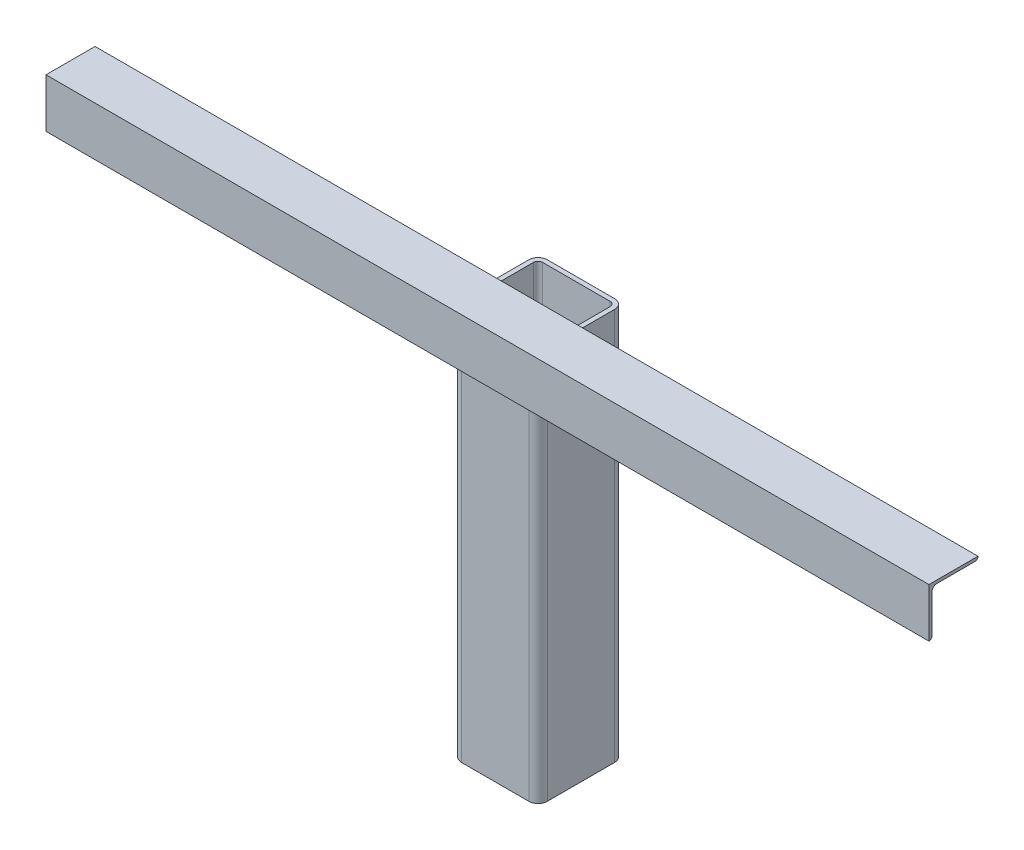
ISO-10303-21;
HEADER;
FILE_DESCRIPTION(('STEP AP214'),'2;1');
FILE_NAME('part.step','',(''),(''),'','','');
FILE_SCHEMA(('AUTOMOTIVE_DESIGN { 1 0 10303 214 1 1 1 1 }'));
ENDSEC;
DATA;
#1=APPLICATION_CONTEXT('core data for automotive mechanical design processes');
#2=APPLICATION_PROTOCOL_DEFINITION('international standard','automotive_design',2000,#1);
#3=PRODUCT_CONTEXT('',#1,'mechanical');
#4=PRODUCT('Part','Part','',(#3));
#5=PRODUCT_RELATED_PRODUCT_CATEGORY('part','',(#4));
#6=PRODUCT_DEFINITION_FORMATION('','',#4);
#7=PRODUCT_DEFINITION_CONTEXT('part definition',#1,'design');
#8=PRODUCT_DEFINITION('design','',#6,#7);
#9=PRODUCT_DEFINITION_SHAPE('','',#8);
#10=(LENGTH_UNIT() NAMED_UNIT(*) SI_UNIT(.MILLI.,.METRE.));
#11=(NAMED_UNIT(*) PLANE_ANGLE_UNIT() SI_UNIT($,.RADIAN.));
#12=(NAMED_UNIT(*) SI_UNIT($,.STERADIAN.) SOLID_ANGLE_UNIT());
#13=UNCERTAINTY_MEASURE_WITH_UNIT(LENGTH_MEASURE(1.E-05),#10,'distance_accuracy_value','');
#14=(GEOMETRIC_REPRESENTATION_CONTEXT(3) GLOBAL_UNCERTAINTY_ASSIGNED_CONTEXT((#13)) GLOBAL_UNIT_ASSIGNED_CONTEXT((#10,
#11,#12)) REPRESENTATION_CONTEXT('',''));
#15=CARTESIAN_POINT('',(0.,0.,0.));
#16=DIRECTION('',(0.,0.,1.));
#17=DIRECTION('',(1.,0.,0.));
#18=AXIS2_PLACEMENT_3D('',#15,#16,#17);
#19=CARTESIAN_POINT('',(-457.2,409.575,-42.8625000000001));
#20=DIRECTION('',(0.,-1.,0.));
#21=DIRECTION('',(0.,0.,-1.));
#22=AXIS2_PLACEMENT_3D('',#19,#20,#21);
#23=PLANE('',#22);
#24=DIRECTION('',(0.,0.,-1.));
#25=VECTOR('',#24,1.);
#26=CARTESIAN_POINT('',(457.2,409.575,-42.8625000000001));
#27=LINE('',#26,#25);
#28=CARTESIAN_POINT('',(457.2,409.575,7.93749999999993));
#29=VERTEX_POINT('',#28);
#30=CARTESIAN_POINT('',(457.2,409.575,-42.8625000000001));
#31=VERTEX_POINT('',#30);
#32=EDGE_CURVE('E199',#29,#31,#27,.T.);
#33=ORIENTED_EDGE('',*,*,#32,.T.);
#34=DIRECTION('',(1.,0.,0.));
#35=VECTOR('',#34,1.);
#36=CARTESIAN_POINT('',(-457.2,409.575,-42.8625000000001));
#37=LINE('',#36,#35);
#38=CARTESIAN_POINT('',(-457.2,409.575,-42.8625000000001));
#39=VERTEX_POINT('',#38);
#40=EDGE_CURVE('E13',#39,#31,#37,.T.);
#41=ORIENTED_EDGE('',*,*,#40,.F.);
#42=DIRECTION('',(0.,0.,-1.));
#43=VECTOR('',#42,1.);
#44=CARTESIAN_POINT('',(-457.2,409.575,-42.8625000000001));
#45=LINE('',#44,#43);
#46=CARTESIAN_POINT('',(-457.2,409.575,7.93749999999993));
#47=VERTEX_POINT('',#46);
#48=EDGE_CURVE('E215',#47,#39,#45,.T.);
#49=ORIENTED_EDGE('',*,*,#48,.F.);
#50=DIRECTION('',(1.,0.,0.));
#51=VECTOR('',#50,1.);
#52=CARTESIAN_POINT('',(-457.2,409.575,7.93749999999993));
#53=LINE('',#52,#51);
#54=EDGE_CURVE('E195',#47,#29,#53,.T.);
#55=ORIENTED_EDGE('',*,*,#54,.T.);
#56=EDGE_LOOP('',(#33,#41,#49,#55));
#57=FACE_BOUND('',#56,.T.);
#58=ADVANCED_FACE('F97',(#57),#23,.F.);
#59=CARTESIAN_POINT('',(-457.2,409.56992,-42.8625000000001));
#60=DIRECTION('',(0.,0.,1.));
#61=DIRECTION('',(0.,-1.,0.));
#62=AXIS2_PLACEMENT_3D('',#59,#60,#61);
#63=PLANE('',#62);
#64=DIRECTION('',(0.,-1.,0.));
#65=VECTOR('',#64,1.);
#66=CARTESIAN_POINT('',(457.2,409.56992,-42.8625000000001));
#67=LINE('',#66,#65);
#68=CARTESIAN_POINT('',(457.2,409.56992,-42.8625000000001));
#69=VERTEX_POINT('',#68);
#70=EDGE_CURVE('E202',#31,#69,#67,.T.);
#71=ORIENTED_EDGE('',*,*,#70,.T.);
#72=DIRECTION('',(1.,0.,0.));
#73=VECTOR('',#72,1.);
#74=CARTESIAN_POINT('',(-457.2,409.56992,-42.8625000000001));
#75=LINE('',#74,#73);
#76=CARTESIAN_POINT('',(-457.2,409.56992,-42.8625000000001));
#77=VERTEX_POINT('',#76);
#78=EDGE_CURVE('E105',#77,#69,#75,.T.);
#79=ORIENTED_EDGE('',*,*,#78,.F.);
#80=DIRECTION('',(0.,-1.,0.));
#81=VECTOR('',#80,1.);
#82=CARTESIAN_POINT('',(-457.2,409.56992,-42.8625000000001));
#83=LINE('',#82,#81);
#84=EDGE_CURVE('E159',#39,#77,#83,.T.);
#85=ORIENTED_EDGE('',*,*,#84,.F.);
#86=ORIENTED_EDGE('',*,*,#40,.T.);
#87=EDGE_LOOP('',(#71,#79,#85,#86));
#88=FACE_BOUND('',#87,.T.);
#89=ADVANCED_FACE('F258',(#88),#63,.F.);
#90=CARTESIAN_POINT('',(-457.2,409.56992,-39.6925800000001));
#91=DIRECTION('',(1.,0.,0.));
#92=DIRECTION('',(0.,0.,-1.));
#93=AXIS2_PLACEMENT_3D('',#90,#91,#92);
#94=CYLINDRICAL_SURFACE('',#93,3.16992);
#95=CARTESIAN_POINT('',(457.2,409.56992,-39.6925800000001));
#96=DIRECTION('',(-1.,0.,0.));
#97=DIRECTION('',(0.,0.,-1.));
#98=AXIS2_PLACEMENT_3D('',#95,#96,#97);
#99=CIRCLE('',#98,3.16992);
#100=CARTESIAN_POINT('',(457.2,406.4,-39.69258));
#101=VERTEX_POINT('',#100);
#102=EDGE_CURVE('E204',#69,#101,#99,.T.);
#103=ORIENTED_EDGE('',*,*,#102,.T.);
#104=DIRECTION('',(1.,0.,0.));
#105=VECTOR('',#104,1.);
#106=CARTESIAN_POINT('',(-457.2,406.4,-39.69258));
#107=LINE('',#106,#105);
#108=CARTESIAN_POINT('',(-457.2,406.4,-39.69258));
#109=VERTEX_POINT('',#108);
#110=EDGE_CURVE('E225',#109,#101,#107,.T.);
#111=ORIENTED_EDGE('',*,*,#110,.F.);
#112=CARTESIAN_POINT('',(-457.2,409.56992,-39.6925800000001));
#113=DIRECTION('',(-1.,0.,0.));
#114=DIRECTION('',(0.,0.,-1.));
#115=AXIS2_PLACEMENT_3D('',#112,#113,#114);
#116=CIRCLE('',#115,3.16992);
#117=EDGE_CURVE('E233',#77,#109,#116,.T.);
#118=ORIENTED_EDGE('',*,*,#117,.F.);
#119=ORIENTED_EDGE('',*,*,#78,.T.);
#120=EDGE_LOOP('',(#103,#111,#118,#119));
#121=FACE_BOUND('',#120,.T.);
#122=ADVANCED_FACE('F231',(#121),#94,.T.);
#123=CARTESIAN_POINT('',(-457.2,406.4,0.));
#124=DIRECTION('',(0.,1.,0.));
#125=DIRECTION('',(0.,0.,1.));
#126=AXIS2_PLACEMENT_3D('',#123,#124,#125);
#127=PLANE('',#126);
#128=DIRECTION('',(0.,0.,1.));
#129=VECTOR('',#128,1.);
#130=CARTESIAN_POINT('',(457.2,406.4,0.));
#131=LINE('',#130,#129);
#132=CARTESIAN_POINT('',(457.2,406.4,0.));
#133=VERTEX_POINT('',#132);
#134=EDGE_CURVE('E206',#101,#133,#131,.T.);
#135=ORIENTED_EDGE('',*,*,#134,.T.);
#136=DIRECTION('',(1.,0.,0.));
#137=VECTOR('',#136,1.);
#138=CARTESIAN_POINT('',(-457.2,406.4,0.));
#139=LINE('',#138,#137);
#140=CARTESIAN_POINT('',(-457.2,406.4,0.));
#141=VERTEX_POINT('',#140);
#142=EDGE_CURVE('E222',#141,#133,#139,.T.);
#143=ORIENTED_EDGE('',*,*,#142,.F.);
#144=DIRECTION('',(0.,0.,1.));
#145=VECTOR('',#144,1.);
#146=CARTESIAN_POINT('',(-457.2,406.4,0.));
#147=LINE('',#146,#145);
#148=EDGE_CURVE('E249',#109,#141,#147,.T.);
#149=ORIENTED_EDGE('',*,*,#148,.F.);
#150=ORIENTED_EDGE('',*,*,#110,.T.);
#151=EDGE_LOOP('',(#135,#143,#149,#150));
#152=FACE_BOUND('',#151,.T.);
#153=ADVANCED_FACE('F242',(#152),#127,.F.);
#154=CARTESIAN_POINT('',(-457.2,401.6375,0.));
#155=DIRECTION('',(1.,0.,0.));
#156=DIRECTION('',(0.,0.,-1.));
#157=AXIS2_PLACEMENT_3D('',#154,#155,#156);
#158=CYLINDRICAL_SURFACE('',#157,4.7625);
#159=CARTESIAN_POINT('',(457.2,401.6375,0.));
#160=DIRECTION('',(1.,0.,0.));
#161=DIRECTION('',(0.,0.,1.));
#162=AXIS2_PLACEMENT_3D('',#159,#160,#161);
#163=CIRCLE('',#162,4.7625);
#164=CARTESIAN_POINT('',(457.2,401.6375,4.76249999999998));
#165=VERTEX_POINT('',#164);
#166=EDGE_CURVE('E208',#133,#165,#163,.T.);
#167=ORIENTED_EDGE('',*,*,#166,.T.);
#168=DIRECTION('',(1.,0.,0.));
#169=VECTOR('',#168,1.);
#170=CARTESIAN_POINT('',(-457.2,401.6375,4.76249999999998));
#171=LINE('',#170,#169);
#172=CARTESIAN_POINT('',(-457.2,401.6375,4.76249999999998));
#173=VERTEX_POINT('',#172);
#174=EDGE_CURVE('E219',#173,#165,#171,.T.);
#175=ORIENTED_EDGE('',*,*,#174,.F.);
#176=CARTESIAN_POINT('',(-457.2,401.6375,0.));
#177=DIRECTION('',(1.,0.,0.));
#178=DIRECTION('',(0.,0.,1.));
#179=AXIS2_PLACEMENT_3D('',#176,#177,#178);
#180=CIRCLE('',#179,4.7625);
#181=EDGE_CURVE('E248',#141,#173,#180,.T.);
#182=ORIENTED_EDGE('',*,*,#181,.F.);
#183=ORIENTED_EDGE('',*,*,#142,.T.);
#184=EDGE_LOOP('',(#167,#175,#182,#183));
#185=FACE_BOUND('',#184,.T.);
#186=ADVANCED_FACE('F246',(#185),#158,.F.);
#187=CARTESIAN_POINT('',(-457.2,361.94492,4.76250000000027));
#188=DIRECTION('',(0.,0.,1.));
#189=DIRECTION('',(0.,-1.,0.));
#190=AXIS2_PLACEMENT_3D('',#187,#188,#189);
#191=PLANE('',#190);
#192=DIRECTION('',(0.,-1.,0.));
#193=VECTOR('',#192,1.);
#194=CARTESIAN_POINT('',(457.2,361.94492,4.76250000000027));
#195=LINE('',#194,#193);
#196=CARTESIAN_POINT('',(457.2,361.94492,4.76250000000027));
#197=VERTEX_POINT('',#196);
#198=EDGE_CURVE('E210',#165,#197,#195,.T.);
#199=ORIENTED_EDGE('',*,*,#198,.T.);
#200=DIRECTION('',(1.,0.,0.));
#201=VECTOR('',#200,1.);
#202=CARTESIAN_POINT('',(-457.2,361.94492,4.76250000000027));
#203=LINE('',#202,#201);
#204=CARTESIAN_POINT('',(-457.2,361.94492,4.76250000000027));
#205=VERTEX_POINT('',#204);
#206=EDGE_CURVE('E190',#205,#197,#203,.T.);
#207=ORIENTED_EDGE('',*,*,#206,.F.);
#208=DIRECTION('',(0.,-1.,0.));
#209=VECTOR('',#208,1.);
#210=CARTESIAN_POINT('',(-457.2,361.94492,4.76250000000027));
#211=LINE('',#210,#209);
#212=EDGE_CURVE('E181',#173,#205,#211,.T.);
#213=ORIENTED_EDGE('',*,*,#212,.F.);
#214=ORIENTED_EDGE('',*,*,#174,.T.);
#215=EDGE_LOOP('',(#199,#207,#213,#214));
#216=FACE_BOUND('',#215,.T.);
#217=ADVANCED_FACE('F270',(#216),#191,.F.);
#218=CARTESIAN_POINT('',(-457.2,361.94492,7.93242000000027));
#219=DIRECTION('',(1.,0.,0.));
#220=DIRECTION('',(0.,0.,-1.));
#221=AXIS2_PLACEMENT_3D('',#218,#219,#220);
#222=CYLINDRICAL_SURFACE('',#221,3.16992);
#223=CARTESIAN_POINT('',(457.2,361.94492,7.93242000000027));
#224=DIRECTION('',(-1.,0.,0.));
#225=DIRECTION('',(0.,0.,1.));
#226=AXIS2_PLACEMENT_3D('',#223,#224,#225);
#227=CIRCLE('',#226,3.16992);
#228=CARTESIAN_POINT('',(457.2,358.775,7.93242000000029));
#229=VERTEX_POINT('',#228);
#230=EDGE_CURVE('E189',#197,#229,#227,.T.);
#231=ORIENTED_EDGE('',*,*,#230,.T.);
#232=DIRECTION('',(1.,0.,0.));
#233=VECTOR('',#232,1.);
#234=CARTESIAN_POINT('',(-457.2,358.775,7.93242000000029));
#235=LINE('',#234,#233);
#236=CARTESIAN_POINT('',(-457.2,358.775,7.93242000000029));
#237=VERTEX_POINT('',#236);
#238=EDGE_CURVE('E186',#237,#229,#235,.T.);
#239=ORIENTED_EDGE('',*,*,#238,.F.);
#240=CARTESIAN_POINT('',(-457.2,361.94492,7.93242000000027));
#241=DIRECTION('',(-1.,0.,0.));
#242=DIRECTION('',(0.,0.,1.));
#243=AXIS2_PLACEMENT_3D('',#240,#241,#242);
#244=CIRCLE('',#243,3.16992);
#245=EDGE_CURVE('E175',#205,#237,#244,.T.);
#246=ORIENTED_EDGE('',*,*,#245,.F.);
#247=ORIENTED_EDGE('',*,*,#206,.T.);
#248=EDGE_LOOP('',(#231,#239,#246,#247));
#249=FACE_BOUND('',#248,.T.);
#250=ADVANCED_FACE('F187',(#249),#222,.T.);
#251=CARTESIAN_POINT('',(-457.2,358.775,7.93750000000029));
#252=DIRECTION('',(0.,1.,0.));
#253=DIRECTION('',(0.,0.,1.));
#254=AXIS2_PLACEMENT_3D('',#251,#252,#253);
#255=PLANE('',#254);
#256=DIRECTION('',(0.,0.,1.));
#257=VECTOR('',#256,1.);
#258=CARTESIAN_POINT('',(457.2,358.775,7.93750000000029));
#259=LINE('',#258,#257);
#260=CARTESIAN_POINT('',(457.2,358.775,7.93750000000029));
#261=VERTEX_POINT('',#260);
#262=EDGE_CURVE('E145',#229,#261,#259,.T.);
#263=ORIENTED_EDGE('',*,*,#262,.T.);
#264=DIRECTION('',(1.,0.,0.));
#265=VECTOR('',#264,1.);
#266=CARTESIAN_POINT('',(-457.2,358.775,7.93750000000029));
#267=LINE('',#266,#265);
#268=CARTESIAN_POINT('',(-457.2,358.775,7.93750000000029));
#269=VERTEX_POINT('',#268);
#270=EDGE_CURVE('E191',#269,#261,#267,.T.);
#271=ORIENTED_EDGE('',*,*,#270,.F.);
#272=DIRECTION('',(0.,0.,1.));
#273=VECTOR('',#272,1.);
#274=CARTESIAN_POINT('',(-457.2,358.775,7.93750000000029));
#275=LINE('',#274,#273);
#276=EDGE_CURVE('E179',#237,#269,#275,.T.);
#277=ORIENTED_EDGE('',*,*,#276,.F.);
#278=ORIENTED_EDGE('',*,*,#238,.T.);
#279=EDGE_LOOP('',(#263,#271,#277,#278));
#280=FACE_BOUND('',#279,.T.);
#281=ADVANCED_FACE('F193',(#280),#255,.F.);
#282=CARTESIAN_POINT('',(-457.2,409.575,7.93749999999993));
#283=DIRECTION('',(0.,0.,-1.));
#284=DIRECTION('',(0.,1.,0.));
#285=AXIS2_PLACEMENT_3D('',#282,#283,#284);
#286=PLANE('',#285);
#287=DIRECTION('',(0.,1.,0.));
#288=VECTOR('',#287,1.);
#289=CARTESIAN_POINT('',(457.2,409.575,7.93749999999993));
#290=LINE('',#289,#288);
#291=EDGE_CURVE('E151',#261,#29,#290,.T.);
#292=ORIENTED_EDGE('',*,*,#291,.T.);
#293=ORIENTED_EDGE('',*,*,#54,.F.);
#294=DIRECTION('',(0.,1.,0.));
#295=VECTOR('',#294,1.);
#296=CARTESIAN_POINT('',(-457.2,409.575,7.93749999999993));
#297=LINE('',#296,#295);
#298=EDGE_CURVE('E113',#269,#47,#297,.T.);
#299=ORIENTED_EDGE('',*,*,#298,.F.);
#300=ORIENTED_EDGE('',*,*,#270,.T.);
#301=EDGE_LOOP('',(#292,#293,#299,#300));
#302=FACE_BOUND('',#301,.T.);
#303=ADVANCED_FACE('F278',(#302),#286,.F.);
#304=CARTESIAN_POINT('',(-457.2,361.94492,7.93242000000027));
#305=DIRECTION('',(1.,0.,0.));
#306=DIRECTION('',(0.,0.,1.));
#307=AXIS2_PLACEMENT_3D('',#304,#305,#306);
#308=PLANE('',#307);
#309=ORIENTED_EDGE('',*,*,#48,.T.);
#310=ORIENTED_EDGE('',*,*,#84,.T.);
#311=ORIENTED_EDGE('',*,*,#117,.T.);
#312=ORIENTED_EDGE('',*,*,#148,.T.);
#313=ORIENTED_EDGE('',*,*,#181,.T.);
#314=ORIENTED_EDGE('',*,*,#212,.T.);
#315=ORIENTED_EDGE('',*,*,#245,.T.);
#316=ORIENTED_EDGE('',*,*,#276,.T.);
#317=ORIENTED_EDGE('',*,*,#298,.T.);
#318=EDGE_LOOP('',(#309,#310,#311,#312,#313,#314,#315,#316,#317));
#319=FACE_BOUND('',#318,.T.);
#320=ADVANCED_FACE('F177',(#319),#308,.F.);
#321=CARTESIAN_POINT('',(457.2,361.94492,7.93242000000027));
#322=DIRECTION('',(1.,0.,0.));
#323=DIRECTION('',(0.,0.,1.));
#324=AXIS2_PLACEMENT_3D('',#321,#322,#323);
#325=PLANE('',#324);
#326=ORIENTED_EDGE('',*,*,#32,.F.);
#327=ORIENTED_EDGE('',*,*,#291,.F.);
#328=ORIENTED_EDGE('',*,*,#262,.F.);
#329=ORIENTED_EDGE('',*,*,#230,.F.);
#330=ORIENTED_EDGE('',*,*,#198,.F.);
#331=ORIENTED_EDGE('',*,*,#166,.F.);
#332=ORIENTED_EDGE('',*,*,#134,.F.);
#333=ORIENTED_EDGE('',*,*,#102,.F.);
#334=ORIENTED_EDGE('',*,*,#70,.F.);
#335=EDGE_LOOP('',(#326,#327,#328,#329,#330,#331,#332,#333,#334));
#336=FACE_BOUND('',#335,.T.);
#337=ADVANCED_FACE('F237',(#336),#325,.T.);
#338=CLOSED_SHELL('',(#58,#89,#122,#153,#186,#217,#250,#281,#303,#320,#337));
#339=MANIFOLD_SOLID_BREP('B2',#338);
#340=CARTESIAN_POINT('',(34.925,406.4,-79.3750000000001));
#341=DIRECTION('',(0.,-1.,0.));
#342=DIRECTION('',(0.,0.,-1.));
#343=AXIS2_PLACEMENT_3D('',#340,#341,#342);
#344=CYLINDRICAL_SURFACE('',#343,9.525);
#345=CARTESIAN_POINT('',(34.925,0.,-79.375));
#346=DIRECTION('',(0.,1.,0.));
#347=DIRECTION('',(0.,0.,1.));
#348=AXIS2_PLACEMENT_3D('',#345,#346,#347);
#349=CIRCLE('',#348,9.525);
#350=CARTESIAN_POINT('',(44.45,0.,-79.375));
#351=VERTEX_POINT('',#350);
#352=CARTESIAN_POINT('',(34.925,0.,-88.9));
#353=VERTEX_POINT('',#352);
#354=EDGE_CURVE('E544',#351,#353,#349,.T.);
#355=ORIENTED_EDGE('',*,*,#354,.T.);
#356=DIRECTION('',(0.,-1.,0.));
#357=VECTOR('',#356,1.);
#358=CARTESIAN_POINT('',(34.925,406.4,-88.9));
#359=LINE('',#358,#357);
#360=CARTESIAN_POINT('',(34.925,406.4,-88.9));
#361=VERTEX_POINT('',#360);
#362=EDGE_CURVE('E95',#361,#353,#359,.T.);
#363=ORIENTED_EDGE('',*,*,#362,.F.);
#364=CARTESIAN_POINT('',(34.925,406.4,-79.3750000000001));
#365=DIRECTION('',(0.,1.,0.));
#366=DIRECTION('',(0.,0.,1.));
#367=AXIS2_PLACEMENT_3D('',#364,#365,#366);
#368=CIRCLE('',#367,9.525);
#369=CARTESIAN_POINT('',(44.45,406.4,-79.3750000000001));
#370=VERTEX_POINT('',#369);
#371=EDGE_CURVE('E622',#370,#361,#368,.T.);
#372=ORIENTED_EDGE('',*,*,#371,.F.);
#373=DIRECTION('',(0.,-1.,0.));
#374=VECTOR('',#373,1.);
#375=CARTESIAN_POINT('',(44.45,406.4,-79.3750000000001));
#376=LINE('',#375,#374);
#377=EDGE_CURVE('E559',#370,#351,#376,.T.);
#378=ORIENTED_EDGE('',*,*,#377,.T.);
#379=EDGE_LOOP('',(#355,#363,#372,#378));
#380=FACE_BOUND('',#379,.T.);
#381=ADVANCED_FACE('F372',(#380),#344,.T.);
#382=CARTESIAN_POINT('',(34.925,406.4,-88.9));
#383=DIRECTION('',(0.,0.,1.));
#384=DIRECTION('',(0.,-1.,0.));
#385=AXIS2_PLACEMENT_3D('',#382,#383,#384);
#386=PLANE('',#385);
#387=DIRECTION('',(-1.,0.,0.));
#388=VECTOR('',#387,1.);
#389=CARTESIAN_POINT('',(34.925,0.,-88.9));
#390=LINE('',#389,#388);
#391=CARTESIAN_POINT('',(-34.925,0.,-88.9));
#392=VERTEX_POINT('',#391);
#393=EDGE_CURVE('E547',#353,#392,#390,.T.);
#394=ORIENTED_EDGE('',*,*,#393,.T.);
#395=DIRECTION('',(0.,-1.,0.));
#396=VECTOR('',#395,1.);
#397=CARTESIAN_POINT('',(-34.925,406.4,-88.9));
#398=LINE('',#397,#396);
#399=CARTESIAN_POINT('',(-34.925,406.4,-88.9));
#400=VERTEX_POINT('',#399);
#401=EDGE_CURVE('E382',#400,#392,#398,.T.);
#402=ORIENTED_EDGE('',*,*,#401,.F.);
#403=DIRECTION('',(-1.,0.,0.));
#404=VECTOR('',#403,1.);
#405=CARTESIAN_POINT('',(34.925,406.4,-88.9));
#406=LINE('',#405,#404);
#407=EDGE_CURVE('E624',#361,#400,#406,.T.);
#408=ORIENTED_EDGE('',*,*,#407,.F.);
#409=ORIENTED_EDGE('',*,*,#362,.T.);
#410=EDGE_LOOP('',(#394,#402,#408,#409));
#411=FACE_BOUND('',#410,.T.);
#412=ADVANCED_FACE('F659',(#411),#386,.F.);
#413=CARTESIAN_POINT('',(-34.925,406.4,-79.3750000000001));
#414=DIRECTION('',(0.,-1.,0.));
#415=DIRECTION('',(0.,0.,-1.));
#416=AXIS2_PLACEMENT_3D('',#413,#414,#415);
#417=CYLINDRICAL_SURFACE('',#416,9.525);
#418=CARTESIAN_POINT('',(-34.925,0.,-79.375));
#419=DIRECTION('',(0.,1.,0.));
#420=DIRECTION('',(0.,0.,1.));
#421=AXIS2_PLACEMENT_3D('',#418,#419,#420);
#422=CIRCLE('',#421,9.525);
#423=CARTESIAN_POINT('',(-44.45,0.,-79.375));
#424=VERTEX_POINT('',#423);
#425=EDGE_CURVE('E549',#392,#424,#422,.T.);
#426=ORIENTED_EDGE('',*,*,#425,.T.);
#427=DIRECTION('',(0.,-1.,0.));
#428=VECTOR('',#427,1.);
#429=CARTESIAN_POINT('',(-44.45,406.4,-79.3750000000001));
#430=LINE('',#429,#428);
#431=CARTESIAN_POINT('',(-44.45,406.4,-79.3750000000001));
#432=VERTEX_POINT('',#431);
#433=EDGE_CURVE('E566',#432,#424,#430,.T.);
#434=ORIENTED_EDGE('',*,*,#433,.F.);
#435=CARTESIAN_POINT('',(-34.925,406.4,-79.3750000000001));
#436=DIRECTION('',(0.,1.,0.));
#437=DIRECTION('',(0.,0.,1.));
#438=AXIS2_PLACEMENT_3D('',#435,#436,#437);
#439=CIRCLE('',#438,9.525);
#440=EDGE_CURVE('E626',#400,#432,#439,.T.);
#441=ORIENTED_EDGE('',*,*,#440,.F.);
#442=ORIENTED_EDGE('',*,*,#401,.T.);
#443=EDGE_LOOP('',(#426,#434,#441,#442));
#444=FACE_BOUND('',#443,.T.);
#445=ADVANCED_FACE('F664',(#444),#417,.T.);
#446=CARTESIAN_POINT('',(-44.45,406.4,-9.52500000000006));
#447=DIRECTION('',(1.,0.,0.));
#448=DIRECTION('',(0.,0.,-1.));
#449=AXIS2_PLACEMENT_3D('',#446,#447,#448);
#450=PLANE('',#449);
#451=DIRECTION('',(0.,0.,1.));
#452=VECTOR('',#451,1.);
#453=CARTESIAN_POINT('',(-44.45,0.,-9.525));
#454=LINE('',#453,#452);
#455=CARTESIAN_POINT('',(-44.45,0.,-9.525));
#456=VERTEX_POINT('',#455);
#457=EDGE_CURVE('E551',#424,#456,#454,.T.);
#458=ORIENTED_EDGE('',*,*,#457,.T.);
#459=DIRECTION('',(0.,-1.,0.));
#460=VECTOR('',#459,1.);
#461=CARTESIAN_POINT('',(-44.45,406.4,-9.52500000000006));
#462=LINE('',#461,#460);
#463=CARTESIAN_POINT('',(-44.45,406.4,-9.52500000000006));
#464=VERTEX_POINT('',#463);
#465=EDGE_CURVE('E563',#464,#456,#462,.T.);
#466=ORIENTED_EDGE('',*,*,#465,.F.);
#467=DIRECTION('',(0.,0.,1.));
#468=VECTOR('',#467,1.);
#469=CARTESIAN_POINT('',(-44.45,406.4,-9.52500000000006));
#470=LINE('',#469,#468);
#471=EDGE_CURVE('E628',#432,#464,#470,.T.);
#472=ORIENTED_EDGE('',*,*,#471,.F.);
#473=ORIENTED_EDGE('',*,*,#433,.T.);
#474=EDGE_LOOP('',(#458,#466,#472,#473));
#475=FACE_BOUND('',#474,.T.);
#476=ADVANCED_FACE('F634',(#475),#450,.F.);
#477=CARTESIAN_POINT('',(-34.925,406.4,-9.52500000000006));
#478=DIRECTION('',(0.,-1.,0.));
#479=DIRECTION('',(0.,0.,-1.));
#480=AXIS2_PLACEMENT_3D('',#477,#478,#479);
#481=CYLINDRICAL_SURFACE('',#480,9.525);
#482=CARTESIAN_POINT('',(-34.925,0.,-9.525));
#483=DIRECTION('',(0.,1.,0.));
#484=DIRECTION('',(0.,0.,1.));
#485=AXIS2_PLACEMENT_3D('',#482,#483,#484);
#486=CIRCLE('',#485,9.525);
#487=CARTESIAN_POINT('',(-34.925,0.,0.));
#488=VERTEX_POINT('',#487);
#489=EDGE_CURVE('E553',#456,#488,#486,.T.);
#490=ORIENTED_EDGE('',*,*,#489,.T.);
#491=DIRECTION('',(0.,-1.,0.));
#492=VECTOR('',#491,1.);
#493=CARTESIAN_POINT('',(-34.925,406.4,0.));
#494=LINE('',#493,#492);
#495=CARTESIAN_POINT('',(-34.925,406.4,0.));
#496=VERTEX_POINT('',#495);
#497=EDGE_CURVE('E511',#496,#488,#494,.T.);
#498=ORIENTED_EDGE('',*,*,#497,.F.);
#499=CARTESIAN_POINT('',(-34.925,406.4,-9.52500000000006));
#500=DIRECTION('',(0.,1.,0.));
#501=DIRECTION('',(0.,0.,1.));
#502=AXIS2_PLACEMENT_3D('',#499,#500,#501);
#503=CIRCLE('',#502,9.525);
#504=EDGE_CURVE('E502',#464,#496,#503,.T.);
#505=ORIENTED_EDGE('',*,*,#504,.F.);
#506=ORIENTED_EDGE('',*,*,#465,.T.);
#507=EDGE_LOOP('',(#490,#498,#505,#506));
#508=FACE_BOUND('',#507,.T.);
#509=ADVANCED_FACE('F638',(#508),#481,.T.);
#510=CARTESIAN_POINT('',(-34.925,406.4,0.));
#511=DIRECTION('',(0.,0.,-1.));
#512=DIRECTION('',(0.,1.,0.));
#513=AXIS2_PLACEMENT_3D('',#510,#511,#512);
#514=PLANE('',#513);
#515=DIRECTION('',(1.,0.,0.));
#516=VECTOR('',#515,1.);
#517=CARTESIAN_POINT('',(-34.925,0.,0.));
#518=LINE('',#517,#516);
#519=CARTESIAN_POINT('',(34.925,0.,0.));
#520=VERTEX_POINT('',#519);
#521=EDGE_CURVE('E510',#488,#520,#518,.T.);
#522=ORIENTED_EDGE('',*,*,#521,.T.);
#523=DIRECTION('',(0.,-1.,0.));
#524=VECTOR('',#523,1.);
#525=CARTESIAN_POINT('',(34.925,406.4,0.));
#526=LINE('',#525,#524);
#527=CARTESIAN_POINT('',(34.925,406.4,0.));
#528=VERTEX_POINT('',#527);
#529=EDGE_CURVE('E507',#528,#520,#526,.T.);
#530=ORIENTED_EDGE('',*,*,#529,.F.);
#531=DIRECTION('',(1.,0.,0.));
#532=VECTOR('',#531,1.);
#533=CARTESIAN_POINT('',(-34.925,406.4,0.));
#534=LINE('',#533,#532);
#535=EDGE_CURVE('E496',#496,#528,#534,.T.);
#536=ORIENTED_EDGE('',*,*,#535,.F.);
#537=ORIENTED_EDGE('',*,*,#497,.T.);
#538=EDGE_LOOP('',(#522,#530,#536,#537));
#539=FACE_BOUND('',#538,.T.);
#540=ADVANCED_FACE('F508',(#539),#514,.F.);
#541=CARTESIAN_POINT('',(34.925,406.4,-9.52500000000006));
#542=DIRECTION('',(0.,-1.,0.));
#543=DIRECTION('',(0.,0.,-1.));
#544=AXIS2_PLACEMENT_3D('',#541,#542,#543);
#545=CYLINDRICAL_SURFACE('',#544,9.525);
#546=CARTESIAN_POINT('',(34.925,0.,-9.525));
#547=DIRECTION('',(0.,1.,0.));
#548=DIRECTION('',(0.,0.,1.));
#549=AXIS2_PLACEMENT_3D('',#546,#547,#548);
#550=CIRCLE('',#549,9.525);
#551=CARTESIAN_POINT('',(44.45,0.,-9.525));
#552=VERTEX_POINT('',#551);
#553=EDGE_CURVE('E444',#520,#552,#550,.T.);
#554=ORIENTED_EDGE('',*,*,#553,.T.);
#555=DIRECTION('',(0.,-1.,0.));
#556=VECTOR('',#555,1.);
#557=CARTESIAN_POINT('',(44.45,406.4,-9.52500000000006));
#558=LINE('',#557,#556);
#559=CARTESIAN_POINT('',(44.45,406.4,-9.52500000000006));
#560=VERTEX_POINT('',#559);
#561=EDGE_CURVE('E512',#560,#552,#558,.T.);
#562=ORIENTED_EDGE('',*,*,#561,.F.);
#563=CARTESIAN_POINT('',(34.925,406.4,-9.52500000000006));
#564=DIRECTION('',(0.,1.,0.));
#565=DIRECTION('',(0.,0.,1.));
#566=AXIS2_PLACEMENT_3D('',#563,#564,#565);
#567=CIRCLE('',#566,9.525);
#568=EDGE_CURVE('E500',#528,#560,#567,.T.);
#569=ORIENTED_EDGE('',*,*,#568,.F.);
#570=ORIENTED_EDGE('',*,*,#529,.T.);
#571=EDGE_LOOP('',(#554,#562,#569,#570));
#572=FACE_BOUND('',#571,.T.);
#573=ADVANCED_FACE('F514',(#572),#545,.T.);
#574=CARTESIAN_POINT('',(-34.925,406.4,-79.3750000000001));
#575=DIRECTION('',(0.,-1.,0.));
#576=DIRECTION('',(0.,0.,-1.));
#577=AXIS2_PLACEMENT_3D('',#574,#575,#576);
#578=CYLINDRICAL_SURFACE('',#577,4.7625);
#579=CARTESIAN_POINT('',(-34.925,0.,-79.375));
#580=DIRECTION('',(0.,1.,0.));
#581=DIRECTION('',(0.,0.,1.));
#582=AXIS2_PLACEMENT_3D('',#579,#580,#581);
#583=CIRCLE('',#582,4.7625);
#584=CARTESIAN_POINT('',(-34.925,0.,-84.1375));
#585=VERTEX_POINT('',#584);
#586=CARTESIAN_POINT('',(-39.6875,0.,-79.375));
#587=VERTEX_POINT('',#586);
#588=EDGE_CURVE('E520',#585,#587,#583,.T.);
#589=ORIENTED_EDGE('',*,*,#588,.F.);
#590=DIRECTION('',(0.,-1.,0.));
#591=VECTOR('',#590,1.);
#592=CARTESIAN_POINT('',(-34.925,406.4,-84.1375));
#593=LINE('',#592,#591);
#594=CARTESIAN_POINT('',(-34.925,406.4,-84.1375));
#595=VERTEX_POINT('',#594);
#596=EDGE_CURVE('E376',#595,#585,#593,.T.);
#597=ORIENTED_EDGE('',*,*,#596,.F.);
#598=CARTESIAN_POINT('',(-34.925,406.4,-79.3750000000001));
#599=DIRECTION('',(0.,1.,0.));
#600=DIRECTION('',(0.,0.,1.));
#601=AXIS2_PLACEMENT_3D('',#598,#599,#600);
#602=CIRCLE('',#601,4.7625);
#603=CARTESIAN_POINT('',(-39.6875,406.4,-79.3750000000001));
#604=VERTEX_POINT('',#603);
#605=EDGE_CURVE('E558',#595,#604,#602,.T.);
#606=ORIENTED_EDGE('',*,*,#605,.T.);
#607=DIRECTION('',(0.,-1.,0.));
#608=VECTOR('',#607,1.);
#609=CARTESIAN_POINT('',(-39.6875,406.4,-79.3750000000001));
#610=LINE('',#609,#608);
#611=EDGE_CURVE('E516',#604,#587,#610,.T.);
#612=ORIENTED_EDGE('',*,*,#611,.T.);
#613=EDGE_LOOP('',(#589,#597,#606,#612));
#614=FACE_BOUND('',#613,.T.);
#615=ADVANCED_FACE('F374',(#614),#578,.F.);
#616=CARTESIAN_POINT('',(34.925,406.4,-84.1375));
#617=DIRECTION('',(0.,0.,1.));
#618=DIRECTION('',(0.,-1.,0.));
#619=AXIS2_PLACEMENT_3D('',#616,#617,#618);
#620=PLANE('',#619);
#621=DIRECTION('',(-1.,0.,0.));
#622=VECTOR('',#621,1.);
#623=CARTESIAN_POINT('',(34.925,0.,-84.1375));
#624=LINE('',#623,#622);
#625=CARTESIAN_POINT('',(34.925,0.,-84.1375));
#626=VERTEX_POINT('',#625);
#627=EDGE_CURVE('E523',#626,#585,#624,.T.);
#628=ORIENTED_EDGE('',*,*,#627,.F.);
#629=DIRECTION('',(0.,-1.,0.));
#630=VECTOR('',#629,1.);
#631=CARTESIAN_POINT('',(34.925,406.4,-84.1375));
#632=LINE('',#631,#630);
#633=CARTESIAN_POINT('',(34.925,406.4,-84.1375));
#634=VERTEX_POINT('',#633);
#635=EDGE_CURVE('E581',#634,#626,#632,.T.);
#636=ORIENTED_EDGE('',*,*,#635,.F.);
#637=DIRECTION('',(-1.,0.,0.));
#638=VECTOR('',#637,1.);
#639=CARTESIAN_POINT('',(34.925,406.4,-84.1375));
#640=LINE('',#639,#638);
#641=EDGE_CURVE('E590',#634,#595,#640,.T.);
#642=ORIENTED_EDGE('',*,*,#641,.T.);
#643=ORIENTED_EDGE('',*,*,#596,.T.);
#644=EDGE_LOOP('',(#628,#636,#642,#643));
#645=FACE_BOUND('',#644,.T.);
#646=ADVANCED_FACE('F588',(#645),#620,.T.);
#647=CARTESIAN_POINT('',(34.925,406.4,-79.3750000000001));
#648=DIRECTION('',(0.,-1.,0.));
#649=DIRECTION('',(0.,0.,-1.));
#650=AXIS2_PLACEMENT_3D('',#647,#648,#649);
#651=CYLINDRICAL_SURFACE('',#650,4.7625);
#652=CARTESIAN_POINT('',(34.925,0.,-79.375));
#653=DIRECTION('',(0.,1.,0.));
#654=DIRECTION('',(0.,0.,1.));
#655=AXIS2_PLACEMENT_3D('',#652,#653,#654);
#656=CIRCLE('',#655,4.7625);
#657=CARTESIAN_POINT('',(39.6875,0.,-79.375));
#658=VERTEX_POINT('',#657);
#659=EDGE_CURVE('E526',#658,#626,#656,.T.);
#660=ORIENTED_EDGE('',*,*,#659,.F.);
#661=DIRECTION('',(0.,-1.,0.));
#662=VECTOR('',#661,1.);
#663=CARTESIAN_POINT('',(39.6875,406.4,-79.3750000000001));
#664=LINE('',#663,#662);
#665=CARTESIAN_POINT('',(39.6875,406.4,-79.3750000000001));
#666=VERTEX_POINT('',#665);
#667=EDGE_CURVE('E580',#666,#658,#664,.T.);
#668=ORIENTED_EDGE('',*,*,#667,.F.);
#669=CARTESIAN_POINT('',(34.925,406.4,-79.3750000000001));
#670=DIRECTION('',(0.,1.,0.));
#671=DIRECTION('',(0.,0.,1.));
#672=AXIS2_PLACEMENT_3D('',#669,#670,#671);
#673=CIRCLE('',#672,4.7625);
#674=EDGE_CURVE('E598',#666,#634,#673,.T.);
#675=ORIENTED_EDGE('',*,*,#674,.T.);
#676=ORIENTED_EDGE('',*,*,#635,.T.);
#677=EDGE_LOOP('',(#660,#668,#675,#676));
#678=FACE_BOUND('',#677,.T.);
#679=ADVANCED_FACE('F596',(#678),#651,.F.);
#680=CARTESIAN_POINT('',(39.6875,406.4,-79.3750000000001));
#681=DIRECTION('',(-1.,0.,0.));
#682=DIRECTION('',(0.,0.,1.));
#683=AXIS2_PLACEMENT_3D('',#680,#681,#682);
#684=PLANE('',#683);
#685=DIRECTION('',(0.,0.,-1.));
#686=VECTOR('',#685,1.);
#687=CARTESIAN_POINT('',(39.6875,0.,-79.375));
#688=LINE('',#687,#686);
#689=CARTESIAN_POINT('',(39.6875,0.,-9.525));
#690=VERTEX_POINT('',#689);
#691=EDGE_CURVE('E529',#690,#658,#688,.T.);
#692=ORIENTED_EDGE('',*,*,#691,.F.);
#693=DIRECTION('',(0.,-1.,0.));
#694=VECTOR('',#693,1.);
#695=CARTESIAN_POINT('',(39.6875,406.4,-9.52500000000006));
#696=LINE('',#695,#694);
#697=CARTESIAN_POINT('',(39.6875,406.4,-9.52500000000006));
#698=VERTEX_POINT('',#697);
#699=EDGE_CURVE('E578',#698,#690,#696,.T.);
#700=ORIENTED_EDGE('',*,*,#699,.F.);
#701=DIRECTION('',(0.,0.,-1.));
#702=VECTOR('',#701,1.);
#703=CARTESIAN_POINT('',(39.6875,406.4,-79.3750000000001));
#704=LINE('',#703,#702);
#705=EDGE_CURVE('E604',#698,#666,#704,.T.);
#706=ORIENTED_EDGE('',*,*,#705,.T.);
#707=ORIENTED_EDGE('',*,*,#667,.T.);
#708=EDGE_LOOP('',(#692,#700,#706,#707));
#709=FACE_BOUND('',#708,.T.);
#710=ADVANCED_FACE('F607',(#709),#684,.T.);
#711=CARTESIAN_POINT('',(34.925,406.4,-9.52500000000006));
#712=DIRECTION('',(0.,-1.,0.));
#713=DIRECTION('',(0.,0.,-1.));
#714=AXIS2_PLACEMENT_3D('',#711,#712,#713);
#715=CYLINDRICAL_SURFACE('',#714,4.7625);
#716=CARTESIAN_POINT('',(34.925,0.,-9.525));
#717=DIRECTION('',(0.,1.,0.));
#718=DIRECTION('',(0.,0.,1.));
#719=AXIS2_PLACEMENT_3D('',#716,#717,#718);
#720=CIRCLE('',#719,4.7625);
#721=CARTESIAN_POINT('',(34.925,0.,-4.7625));
#722=VERTEX_POINT('',#721);
#723=EDGE_CURVE('E532',#722,#690,#720,.T.);
#724=ORIENTED_EDGE('',*,*,#723,.F.);
#725=DIRECTION('',(0.,-1.,0.));
#726=VECTOR('',#725,1.);
#727=CARTESIAN_POINT('',(34.925,406.4,-4.76250000000006));
#728=LINE('',#727,#726);
#729=CARTESIAN_POINT('',(34.925,406.4,-4.76250000000006));
#730=VERTEX_POINT('',#729);
#731=EDGE_CURVE('E576',#730,#722,#728,.T.);
#732=ORIENTED_EDGE('',*,*,#731,.F.);
#733=CARTESIAN_POINT('',(34.925,406.4,-9.52500000000006));
#734=DIRECTION('',(0.,1.,0.));
#735=DIRECTION('',(0.,0.,1.));
#736=AXIS2_PLACEMENT_3D('',#733,#734,#735);
#737=CIRCLE('',#736,4.7625);
#738=EDGE_CURVE('E608',#730,#698,#737,.T.);
#739=ORIENTED_EDGE('',*,*,#738,.T.);
#740=ORIENTED_EDGE('',*,*,#699,.T.);
#741=EDGE_LOOP('',(#724,#732,#739,#740));
#742=FACE_BOUND('',#741,.T.);
#743=ADVANCED_FACE('F675',(#742),#715,.F.);
#744=CARTESIAN_POINT('',(-34.925,406.4,-4.76250000000006));
#745=DIRECTION('',(0.,0.,-1.));
#746=DIRECTION('',(0.,1.,0.));
#747=AXIS2_PLACEMENT_3D('',#744,#745,#746);
#748=PLANE('',#747);
#749=DIRECTION('',(1.,0.,0.));
#750=VECTOR('',#749,1.);
#751=CARTESIAN_POINT('',(-34.925,0.,-4.7625));
#752=LINE('',#751,#750);
#753=CARTESIAN_POINT('',(-34.925,0.,-4.7625));
#754=VERTEX_POINT('',#753);
#755=EDGE_CURVE('E535',#754,#722,#752,.T.);
#756=ORIENTED_EDGE('',*,*,#755,.F.);
#757=DIRECTION('',(0.,-1.,0.));
#758=VECTOR('',#757,1.);
#759=CARTESIAN_POINT('',(-34.925,406.4,-4.76250000000006));
#760=LINE('',#759,#758);
#761=CARTESIAN_POINT('',(-34.925,406.4,-4.76250000000006));
#762=VERTEX_POINT('',#761);
#763=EDGE_CURVE('E574',#762,#754,#760,.T.);
#764=ORIENTED_EDGE('',*,*,#763,.F.);
#765=DIRECTION('',(1.,0.,0.));
#766=VECTOR('',#765,1.);
#767=CARTESIAN_POINT('',(-34.925,406.4,-4.76250000000006));
#768=LINE('',#767,#766);
#769=EDGE_CURVE('E610',#762,#730,#768,.T.);
#770=ORIENTED_EDGE('',*,*,#769,.T.);
#771=ORIENTED_EDGE('',*,*,#731,.T.);
#772=EDGE_LOOP('',(#756,#764,#770,#771));
#773=FACE_BOUND('',#772,.T.);
#774=ADVANCED_FACE('F671',(#773),#748,.T.);
#775=CARTESIAN_POINT('',(-34.925,406.4,-9.52500000000006));
#776=DIRECTION('',(0.,-1.,0.));
#777=DIRECTION('',(0.,0.,-1.));
#778=AXIS2_PLACEMENT_3D('',#775,#776,#777);
#779=CYLINDRICAL_SURFACE('',#778,4.7625);
#780=CARTESIAN_POINT('',(-34.925,0.,-9.525));
#781=DIRECTION('',(0.,1.,0.));
#782=DIRECTION('',(0.,0.,1.));
#783=AXIS2_PLACEMENT_3D('',#780,#781,#782);
#784=CIRCLE('',#783,4.7625);
#785=CARTESIAN_POINT('',(-39.6875,0.,-9.525));
#786=VERTEX_POINT('',#785);
#787=EDGE_CURVE('E538',#786,#754,#784,.T.);
#788=ORIENTED_EDGE('',*,*,#787,.F.);
#789=DIRECTION('',(0.,-1.,0.));
#790=VECTOR('',#789,1.);
#791=CARTESIAN_POINT('',(-39.6875,406.4,-9.52500000000006));
#792=LINE('',#791,#790);
#793=CARTESIAN_POINT('',(-39.6875,406.4,-9.52500000000006));
#794=VERTEX_POINT('',#793);
#795=EDGE_CURVE('E572',#794,#786,#792,.T.);
#796=ORIENTED_EDGE('',*,*,#795,.F.);
#797=CARTESIAN_POINT('',(-34.925,406.4,-9.52500000000006));
#798=DIRECTION('',(0.,1.,0.));
#799=DIRECTION('',(0.,0.,1.));
#800=AXIS2_PLACEMENT_3D('',#797,#798,#799);
#801=CIRCLE('',#800,4.7625);
#802=EDGE_CURVE('E616',#794,#762,#801,.T.);
#803=ORIENTED_EDGE('',*,*,#802,.T.);
#804=ORIENTED_EDGE('',*,*,#763,.T.);
#805=EDGE_LOOP('',(#788,#796,#803,#804));
#806=FACE_BOUND('',#805,.T.);
#807=ADVANCED_FACE('F653',(#806),#779,.F.);
#808=CARTESIAN_POINT('',(-39.6875,406.4,-9.52500000000006));
#809=DIRECTION('',(1.,0.,0.));
#810=DIRECTION('',(0.,0.,-1.));
#811=AXIS2_PLACEMENT_3D('',#808,#809,#810);
#812=PLANE('',#811);
#813=DIRECTION('',(0.,0.,1.));
#814=VECTOR('',#813,1.);
#815=CARTESIAN_POINT('',(-39.6875,0.,-9.525));
#816=LINE('',#815,#814);
#817=EDGE_CURVE('E541',#587,#786,#816,.T.);
#818=ORIENTED_EDGE('',*,*,#817,.F.);
#819=ORIENTED_EDGE('',*,*,#611,.F.);
#820=DIRECTION('',(0.,0.,1.));
#821=VECTOR('',#820,1.);
#822=CARTESIAN_POINT('',(-39.6875,406.4,-9.52500000000006));
#823=LINE('',#822,#821);
#824=EDGE_CURVE('E619',#604,#794,#823,.T.);
#825=ORIENTED_EDGE('',*,*,#824,.T.);
#826=ORIENTED_EDGE('',*,*,#795,.T.);
#827=EDGE_LOOP('',(#818,#819,#825,#826));
#828=FACE_BOUND('',#827,.T.);
#829=ADVANCED_FACE('F646',(#828),#812,.T.);
#830=CARTESIAN_POINT('',(44.45,406.4,-79.3750000000001));
#831=DIRECTION('',(-1.,0.,0.));
#832=DIRECTION('',(0.,0.,1.));
#833=AXIS2_PLACEMENT_3D('',#830,#831,#832);
#834=PLANE('',#833);
#835=DIRECTION('',(0.,0.,-1.));
#836=VECTOR('',#835,1.);
#837=CARTESIAN_POINT('',(44.45,0.,-79.375));
#838=LINE('',#837,#836);
#839=EDGE_CURVE('E450',#552,#351,#838,.T.);
#840=ORIENTED_EDGE('',*,*,#839,.T.);
#841=ORIENTED_EDGE('',*,*,#377,.F.);
#842=DIRECTION('',(0.,0.,-1.));
#843=VECTOR('',#842,1.);
#844=CARTESIAN_POINT('',(44.45,406.4,-79.3750000000001));
#845=LINE('',#844,#843);
#846=EDGE_CURVE('E391',#560,#370,#845,.T.);
#847=ORIENTED_EDGE('',*,*,#846,.F.);
#848=ORIENTED_EDGE('',*,*,#561,.T.);
#849=EDGE_LOOP('',(#840,#841,#847,#848));
#850=FACE_BOUND('',#849,.T.);
#851=ADVANCED_FACE('F644',(#850),#834,.F.);
#852=CARTESIAN_POINT('',(34.925,406.4,-79.3750000000001));
#853=DIRECTION('',(0.,1.,0.));
#854=DIRECTION('',(0.,0.,1.));
#855=AXIS2_PLACEMENT_3D('',#852,#853,#854);
#856=PLANE('',#855);
#857=ORIENTED_EDGE('',*,*,#605,.F.);
#858=ORIENTED_EDGE('',*,*,#641,.F.);
#859=ORIENTED_EDGE('',*,*,#674,.F.);
#860=ORIENTED_EDGE('',*,*,#705,.F.);
#861=ORIENTED_EDGE('',*,*,#738,.F.);
#862=ORIENTED_EDGE('',*,*,#769,.F.);
#863=ORIENTED_EDGE('',*,*,#802,.F.);
#864=ORIENTED_EDGE('',*,*,#824,.F.);
#865=EDGE_LOOP('',(#857,#858,#859,#860,#861,#862,#863,#864));
#866=FACE_BOUND('',#865,.T.);
#867=ORIENTED_EDGE('',*,*,#371,.T.);
#868=ORIENTED_EDGE('',*,*,#407,.T.);
#869=ORIENTED_EDGE('',*,*,#440,.T.);
#870=ORIENTED_EDGE('',*,*,#471,.T.);
#871=ORIENTED_EDGE('',*,*,#504,.T.);
#872=ORIENTED_EDGE('',*,*,#535,.T.);
#873=ORIENTED_EDGE('',*,*,#568,.T.);
#874=ORIENTED_EDGE('',*,*,#846,.T.);
#875=EDGE_LOOP('',(#867,#868,#869,#870,#871,#872,#873,#874));
#876=FACE_BOUND('',#875,.T.);
#877=ADVANCED_FACE('F498',(#866,#876),#856,.T.);
#878=CARTESIAN_POINT('',(34.925,0.,-79.375));
#879=DIRECTION('',(0.,1.,0.));
#880=DIRECTION('',(0.,0.,1.));
#881=AXIS2_PLACEMENT_3D('',#878,#879,#880);
#882=PLANE('',#881);
#883=ORIENTED_EDGE('',*,*,#588,.T.);
#884=ORIENTED_EDGE('',*,*,#817,.T.);
#885=ORIENTED_EDGE('',*,*,#787,.T.);
#886=ORIENTED_EDGE('',*,*,#755,.T.);
#887=ORIENTED_EDGE('',*,*,#723,.T.);
#888=ORIENTED_EDGE('',*,*,#691,.T.);
#889=ORIENTED_EDGE('',*,*,#659,.T.);
#890=ORIENTED_EDGE('',*,*,#627,.T.);
#891=EDGE_LOOP('',(#883,#884,#885,#886,#887,#888,#889,#890));
#892=FACE_BOUND('',#891,.T.);
#893=ORIENTED_EDGE('',*,*,#354,.F.);
#894=ORIENTED_EDGE('',*,*,#839,.F.);
#895=ORIENTED_EDGE('',*,*,#553,.F.);
#896=ORIENTED_EDGE('',*,*,#521,.F.);
#897=ORIENTED_EDGE('',*,*,#489,.F.);
#898=ORIENTED_EDGE('',*,*,#457,.F.);
#899=ORIENTED_EDGE('',*,*,#425,.F.);
#900=ORIENTED_EDGE('',*,*,#393,.F.);
#901=EDGE_LOOP('',(#893,#894,#895,#896,#897,#898,#899,#900));
#902=FACE_BOUND('',#901,.T.);
#903=ADVANCED_FACE('F593',(#892,#902),#882,.F.);
#904=CLOSED_SHELL('',(#381,#412,#445,#476,#509,#540,#573,#615,#646,#679,#710,#743,#774,#807,
#829,#851,#877,#903));
#905=MANIFOLD_SOLID_BREP('B7',#904);
#906=ADVANCED_BREP_SHAPE_REPRESENTATION('',(#18,#339,#905),#14);
#907=SHAPE_DEFINITION_REPRESENTATION(#9,#906);
ENDSEC;
END-ISO-10303-21;
